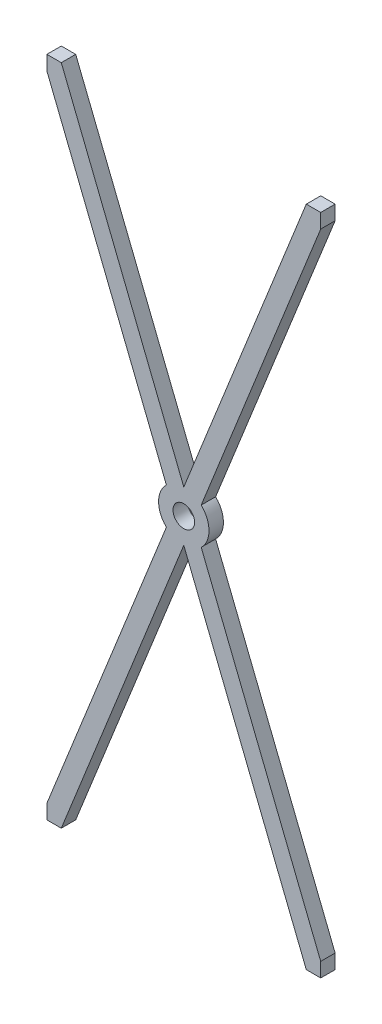
ISO-10303-21;
HEADER;
FILE_DESCRIPTION(('STEP AP214'),'2;1');
FILE_NAME('part.step','',(''),(''),'','','');
FILE_SCHEMA(('AUTOMOTIVE_DESIGN { 1 0 10303 214 1 1 1 1 }'));
ENDSEC;
DATA;
#1=APPLICATION_CONTEXT('core data for automotive mechanical design processes');
#2=APPLICATION_PROTOCOL_DEFINITION('international standard','automotive_design',2000,#1);
#3=PRODUCT_CONTEXT('',#1,'mechanical');
#4=PRODUCT('Part','Part','',(#3));
#5=PRODUCT_RELATED_PRODUCT_CATEGORY('part','',(#4));
#6=PRODUCT_DEFINITION_FORMATION('','',#4);
#7=PRODUCT_DEFINITION_CONTEXT('part definition',#1,'design');
#8=PRODUCT_DEFINITION('design','',#6,#7);
#9=PRODUCT_DEFINITION_SHAPE('','',#8);
#10=(LENGTH_UNIT() NAMED_UNIT(*) SI_UNIT(.MILLI.,.METRE.));
#11=(NAMED_UNIT(*) PLANE_ANGLE_UNIT() SI_UNIT($,.RADIAN.));
#12=(NAMED_UNIT(*) SI_UNIT($,.STERADIAN.) SOLID_ANGLE_UNIT());
#13=UNCERTAINTY_MEASURE_WITH_UNIT(LENGTH_MEASURE(1.E-05),#10,'distance_accuracy_value','');
#14=(GEOMETRIC_REPRESENTATION_CONTEXT(3) GLOBAL_UNCERTAINTY_ASSIGNED_CONTEXT((#13)) GLOBAL_UNIT_ASSIGNED_CONTEXT((#10,
#11,#12)) REPRESENTATION_CONTEXT('',''));
#15=CARTESIAN_POINT('',(0.,0.,0.));
#16=DIRECTION('',(0.,0.,1.));
#17=DIRECTION('',(1.,0.,0.));
#18=AXIS2_PLACEMENT_3D('',#15,#16,#17);
#19=CARTESIAN_POINT('',(0.,0.,50.));
#20=DIRECTION('',(1.,0.,0.));
#21=DIRECTION('',(0.,0.,-1.));
#22=AXIS2_PLACEMENT_3D('',#19,#20,#21);
#23=PLANE('',#22);
#24=DIRECTION('',(0.,-1.,0.));
#25=VECTOR('',#24,1.);
#26=CARTESIAN_POINT('',(0.,0.,0.));
#27=LINE('',#26,#25);
#28=CARTESIAN_POINT('',(0.,50.,0.));
#29=VERTEX_POINT('',#28);
#30=CARTESIAN_POINT('',(0.,0.,0.));
#31=VERTEX_POINT('',#30);
#32=EDGE_CURVE('E292',#29,#31,#27,.T.);
#33=ORIENTED_EDGE('',*,*,#32,.T.);
#34=DIRECTION('',(0.,0.,-1.));
#35=VECTOR('',#34,1.);
#36=CARTESIAN_POINT('',(0.,0.,50.));
#37=LINE('',#36,#35);
#38=CARTESIAN_POINT('',(0.,0.,50.));
#39=VERTEX_POINT('',#38);
#40=EDGE_CURVE('E11',#39,#31,#37,.T.);
#41=ORIENTED_EDGE('',*,*,#40,.F.);
#42=DIRECTION('',(0.,-1.,0.));
#43=VECTOR('',#42,1.);
#44=CARTESIAN_POINT('',(0.,0.,50.));
#45=LINE('',#44,#43);
#46=CARTESIAN_POINT('',(0.,50.,50.));
#47=VERTEX_POINT('',#46);
#48=EDGE_CURVE('E222',#47,#39,#45,.T.);
#49=ORIENTED_EDGE('',*,*,#48,.F.);
#50=DIRECTION('',(0.,0.,-1.));
#51=VECTOR('',#50,1.);
#52=CARTESIAN_POINT('',(0.,50.,50.));
#53=LINE('',#52,#51);
#54=EDGE_CURVE('E223',#47,#29,#53,.T.);
#55=ORIENTED_EDGE('',*,*,#54,.T.);
#56=EDGE_LOOP('',(#33,#41,#49,#55));
#57=FACE_BOUND('',#56,.T.);
#58=ADVANCED_FACE('F39',(#57),#23,.F.);
#59=CARTESIAN_POINT('',(0.,0.,50.));
#60=DIRECTION('',(0.,1.,0.));
#61=DIRECTION('',(0.,0.,1.));
#62=AXIS2_PLACEMENT_3D('',#59,#60,#61);
#63=PLANE('',#62);
#64=DIRECTION('',(1.,0.,0.));
#65=VECTOR('',#64,1.);
#66=CARTESIAN_POINT('',(0.,0.,0.));
#67=LINE('',#66,#65);
#68=CARTESIAN_POINT('',(50.,0.,0.));
#69=VERTEX_POINT('',#68);
#70=EDGE_CURVE('E283',#31,#69,#67,.T.);
#71=ORIENTED_EDGE('',*,*,#70,.T.);
#72=DIRECTION('',(0.,0.,-1.));
#73=VECTOR('',#72,1.);
#74=CARTESIAN_POINT('',(50.,0.,50.));
#75=LINE('',#74,#73);
#76=CARTESIAN_POINT('',(50.,0.,50.));
#77=VERTEX_POINT('',#76);
#78=EDGE_CURVE('E47',#77,#69,#75,.T.);
#79=ORIENTED_EDGE('',*,*,#78,.F.);
#80=DIRECTION('',(1.,0.,0.));
#81=VECTOR('',#80,1.);
#82=CARTESIAN_POINT('',(0.,0.,50.));
#83=LINE('',#82,#81);
#84=EDGE_CURVE('E351',#39,#77,#83,.T.);
#85=ORIENTED_EDGE('',*,*,#84,.F.);
#86=ORIENTED_EDGE('',*,*,#40,.T.);
#87=EDGE_LOOP('',(#71,#79,#85,#86));
#88=FACE_BOUND('',#87,.T.);
#89=ADVANCED_FACE('F374',(#88),#63,.F.);
#90=CARTESIAN_POINT('',(50.,0.,50.));
#91=DIRECTION('',(-0.928476690885259,0.371390676354104,0.));
#92=DIRECTION('',(-0.371390676354104,-0.928476690885259,0.));
#93=AXIS2_PLACEMENT_3D('',#90,#91,#92);
#94=PLANE('',#93);
#95=DIRECTION('',(0.371390676354104,0.928476690885259,0.));
#96=VECTOR('',#95,1.);
#97=CARTESIAN_POINT('',(50.,0.,0.));
#98=LINE('',#97,#96);
#99=CARTESIAN_POINT('',(475.,1062.5,0.));
#100=VERTEX_POINT('',#99);
#101=EDGE_CURVE('E278',#69,#100,#98,.T.);
#102=ORIENTED_EDGE('',*,*,#101,.T.);
#103=DIRECTION('',(0.,0.,-1.));
#104=VECTOR('',#103,1.);
#105=CARTESIAN_POINT('',(475.,1062.5,50.));
#106=LINE('',#105,#104);
#107=CARTESIAN_POINT('',(475.,1062.5,50.));
#108=VERTEX_POINT('',#107);
#109=EDGE_CURVE('E267',#108,#100,#106,.T.);
#110=ORIENTED_EDGE('',*,*,#109,.F.);
#111=DIRECTION('',(0.371390676354104,0.928476690885259,0.));
#112=VECTOR('',#111,1.);
#113=CARTESIAN_POINT('',(50.,0.,50.));
#114=LINE('',#113,#112);
#115=EDGE_CURVE('E279',#77,#108,#114,.T.);
#116=ORIENTED_EDGE('',*,*,#115,.F.);
#117=ORIENTED_EDGE('',*,*,#78,.T.);
#118=EDGE_LOOP('',(#102,#110,#116,#117));
#119=FACE_BOUND('',#118,.T.);
#120=ADVANCED_FACE('F276',(#119),#94,.F.);
#121=CARTESIAN_POINT('',(900.,0.,50.));
#122=DIRECTION('',(0.928476690885259,0.371390676354104,0.));
#123=DIRECTION('',(-0.371390676354104,0.92847669088526,0.));
#124=AXIS2_PLACEMENT_3D('',#121,#122,#123);
#125=PLANE('',#124);
#126=DIRECTION('',(0.371390676354104,-0.928476690885259,0.));
#127=VECTOR('',#126,1.);
#128=CARTESIAN_POINT('',(900.,0.,0.));
#129=LINE('',#128,#127);
#130=CARTESIAN_POINT('',(900.,0.,0.));
#131=VERTEX_POINT('',#130);
#132=EDGE_CURVE('E285',#100,#131,#129,.T.);
#133=ORIENTED_EDGE('',*,*,#132,.T.);
#134=DIRECTION('',(0.,0.,-1.));
#135=VECTOR('',#134,1.);
#136=CARTESIAN_POINT('',(900.,0.,50.));
#137=LINE('',#136,#135);
#138=CARTESIAN_POINT('',(900.,0.,50.));
#139=VERTEX_POINT('',#138);
#140=EDGE_CURVE('E263',#139,#131,#137,.T.);
#141=ORIENTED_EDGE('',*,*,#140,.F.);
#142=DIRECTION('',(0.371390676354104,-0.928476690885259,0.));
#143=VECTOR('',#142,1.);
#144=CARTESIAN_POINT('',(900.,0.,50.));
#145=LINE('',#144,#143);
#146=EDGE_CURVE('E356',#108,#139,#145,.T.);
#147=ORIENTED_EDGE('',*,*,#146,.F.);
#148=ORIENTED_EDGE('',*,*,#109,.T.);
#149=EDGE_LOOP('',(#133,#141,#147,#148));
#150=FACE_BOUND('',#149,.T.);
#151=ADVANCED_FACE('F366',(#150),#125,.F.);
#152=CARTESIAN_POINT('',(900.,0.,50.));
#153=DIRECTION('',(0.,1.,0.));
#154=DIRECTION('',(0.,0.,1.));
#155=AXIS2_PLACEMENT_3D('',#152,#153,#154);
#156=PLANE('',#155);
#157=DIRECTION('',(1.,0.,0.));
#158=VECTOR('',#157,1.);
#159=CARTESIAN_POINT('',(900.,0.,0.));
#160=LINE('',#159,#158);
#161=CARTESIAN_POINT('',(950.,0.,0.));
#162=VERTEX_POINT('',#161);
#163=EDGE_CURVE('E290',#131,#162,#160,.T.);
#164=ORIENTED_EDGE('',*,*,#163,.T.);
#165=DIRECTION('',(0.,0.,-1.));
#166=VECTOR('',#165,1.);
#167=CARTESIAN_POINT('',(950.,0.,50.));
#168=LINE('',#167,#166);
#169=CARTESIAN_POINT('',(950.,0.,50.));
#170=VERTEX_POINT('',#169);
#171=EDGE_CURVE('E259',#170,#162,#168,.T.);
#172=ORIENTED_EDGE('',*,*,#171,.F.);
#173=DIRECTION('',(1.,0.,0.));
#174=VECTOR('',#173,1.);
#175=CARTESIAN_POINT('',(900.,0.,50.));
#176=LINE('',#175,#174);
#177=EDGE_CURVE('E315',#139,#170,#176,.T.);
#178=ORIENTED_EDGE('',*,*,#177,.F.);
#179=ORIENTED_EDGE('',*,*,#140,.T.);
#180=EDGE_LOOP('',(#164,#172,#178,#179));
#181=FACE_BOUND('',#180,.T.);
#182=ADVANCED_FACE('F364',(#181),#156,.F.);
#183=CARTESIAN_POINT('',(950.,50.,50.));
#184=DIRECTION('',(-1.,0.,0.));
#185=DIRECTION('',(0.,0.,1.));
#186=AXIS2_PLACEMENT_3D('',#183,#184,#185);
#187=PLANE('',#186);
#188=DIRECTION('',(0.,1.,0.));
#189=VECTOR('',#188,1.);
#190=CARTESIAN_POINT('',(950.,50.,0.));
#191=LINE('',#190,#189);
#192=CARTESIAN_POINT('',(950.,50.,0.));
#193=VERTEX_POINT('',#192);
#194=EDGE_CURVE('E197',#162,#193,#191,.T.);
#195=ORIENTED_EDGE('',*,*,#194,.T.);
#196=DIRECTION('',(0.,0.,-1.));
#197=VECTOR('',#196,1.);
#198=CARTESIAN_POINT('',(950.,50.,50.));
#199=LINE('',#198,#197);
#200=CARTESIAN_POINT('',(950.,50.,50.));
#201=VERTEX_POINT('',#200);
#202=EDGE_CURVE('E255',#201,#193,#199,.T.);
#203=ORIENTED_EDGE('',*,*,#202,.F.);
#204=DIRECTION('',(0.,1.,0.));
#205=VECTOR('',#204,1.);
#206=CARTESIAN_POINT('',(950.,50.,50.));
#207=LINE('',#206,#205);
#208=EDGE_CURVE('E309',#170,#201,#207,.T.);
#209=ORIENTED_EDGE('',*,*,#208,.F.);
#210=ORIENTED_EDGE('',*,*,#171,.T.);
#211=EDGE_LOOP('',(#195,#203,#209,#210));
#212=FACE_BOUND('',#211,.T.);
#213=ADVANCED_FACE('F301',(#212),#187,.F.);
#214=CARTESIAN_POINT('',(510.,1150.,50.));
#215=DIRECTION('',(-0.928476690885259,-0.371390676354104,0.));
#216=DIRECTION('',(0.371390676354104,-0.92847669088526,0.));
#217=AXIS2_PLACEMENT_3D('',#214,#215,#216);
#218=PLANE('',#217);
#219=DIRECTION('',(-0.371390676354104,0.928476690885259,0.));
#220=VECTOR('',#219,1.);
#221=CARTESIAN_POINT('',(510.,1150.,0.));
#222=LINE('',#221,#220);
#223=CARTESIAN_POINT('',(535.344827586207,1086.63793103448,0.));
#224=VERTEX_POINT('',#223);
#225=EDGE_CURVE('E191',#193,#224,#222,.T.);
#226=ORIENTED_EDGE('',*,*,#225,.T.);
#227=DIRECTION('',(0.,0.,1.));
#228=VECTOR('',#227,1.);
#229=CARTESIAN_POINT('',(535.344827586207,1086.63793103448,0.));
#230=LINE('',#229,#228);
#231=CARTESIAN_POINT('',(535.344827586207,1086.63793103448,50.));
#232=VERTEX_POINT('',#231);
#233=EDGE_CURVE('E168',#224,#232,#230,.T.);
#234=ORIENTED_EDGE('',*,*,#233,.T.);
#235=DIRECTION('',(-0.371390676354104,0.928476690885259,0.));
#236=VECTOR('',#235,1.);
#237=CARTESIAN_POINT('',(510.,1150.,50.));
#238=LINE('',#237,#236);
#239=EDGE_CURVE('E307',#201,#232,#238,.T.);
#240=ORIENTED_EDGE('',*,*,#239,.F.);
#241=ORIENTED_EDGE('',*,*,#202,.T.);
#242=EDGE_LOOP('',(#226,#234,#240,#241));
#243=FACE_BOUND('',#242,.T.);
#244=ADVANCED_FACE('F306',(#243),#218,.F.);
#245=CARTESIAN_POINT('',(510.,1150.,50.));
#246=DIRECTION('',(-0.928476690885259,0.371390676354104,0.));
#247=DIRECTION('',(-0.371390676354104,-0.928476690885259,0.));
#248=AXIS2_PLACEMENT_3D('',#245,#246,#247);
#249=PLANE('',#248);
#250=DIRECTION('',(0.371390676354104,0.928476690885259,0.));
#251=VECTOR('',#250,1.);
#252=CARTESIAN_POINT('',(510.,1150.,50.));
#253=LINE('',#252,#251);
#254=CARTESIAN_POINT('',(535.344827586207,1213.36206896552,50.));
#255=VERTEX_POINT('',#254);
#256=CARTESIAN_POINT('',(950.,2250.,50.));
#257=VERTEX_POINT('',#256);
#258=EDGE_CURVE('E181',#255,#257,#253,.T.);
#259=ORIENTED_EDGE('',*,*,#258,.F.);
#260=DIRECTION('',(0.,0.,1.));
#261=VECTOR('',#260,1.);
#262=CARTESIAN_POINT('',(535.344827586207,1213.36206896552,0.));
#263=LINE('',#262,#261);
#264=CARTESIAN_POINT('',(535.344827586207,1213.36206896552,0.));
#265=VERTEX_POINT('',#264);
#266=EDGE_CURVE('E165',#255,#265,#263,.F.);
#267=ORIENTED_EDGE('',*,*,#266,.T.);
#268=DIRECTION('',(0.371390676354104,0.928476690885259,0.));
#269=VECTOR('',#268,1.);
#270=CARTESIAN_POINT('',(510.,1150.,0.));
#271=LINE('',#270,#269);
#272=CARTESIAN_POINT('',(950.,2250.,0.));
#273=VERTEX_POINT('',#272);
#274=EDGE_CURVE('E179',#265,#273,#271,.T.);
#275=ORIENTED_EDGE('',*,*,#274,.T.);
#276=DIRECTION('',(0.,0.,-1.));
#277=VECTOR('',#276,1.);
#278=CARTESIAN_POINT('',(950.,2250.,50.));
#279=LINE('',#278,#277);
#280=EDGE_CURVE('E252',#257,#273,#279,.T.);
#281=ORIENTED_EDGE('',*,*,#280,.F.);
#282=EDGE_LOOP('',(#259,#267,#275,#281));
#283=FACE_BOUND('',#282,.T.);
#284=ADVANCED_FACE('F177',(#283),#249,.F.);
#285=CARTESIAN_POINT('',(950.,2250.,50.));
#286=DIRECTION('',(-1.,0.,0.));
#287=DIRECTION('',(0.,0.,1.));
#288=AXIS2_PLACEMENT_3D('',#285,#286,#287);
#289=PLANE('',#288);
#290=DIRECTION('',(0.,1.,0.));
#291=VECTOR('',#290,1.);
#292=CARTESIAN_POINT('',(950.,2250.,0.));
#293=LINE('',#292,#291);
#294=CARTESIAN_POINT('',(950.,2300.,0.));
#295=VERTEX_POINT('',#294);
#296=EDGE_CURVE('E189',#273,#295,#293,.T.);
#297=ORIENTED_EDGE('',*,*,#296,.T.);
#298=DIRECTION('',(0.,0.,-1.));
#299=VECTOR('',#298,1.);
#300=CARTESIAN_POINT('',(950.,2300.,50.));
#301=LINE('',#300,#299);
#302=CARTESIAN_POINT('',(950.,2300.,50.));
#303=VERTEX_POINT('',#302);
#304=EDGE_CURVE('E248',#303,#295,#301,.T.);
#305=ORIENTED_EDGE('',*,*,#304,.F.);
#306=DIRECTION('',(0.,1.,0.));
#307=VECTOR('',#306,1.);
#308=CARTESIAN_POINT('',(950.,2250.,50.));
#309=LINE('',#308,#307);
#310=EDGE_CURVE('E313',#257,#303,#309,.T.);
#311=ORIENTED_EDGE('',*,*,#310,.F.);
#312=ORIENTED_EDGE('',*,*,#280,.T.);
#313=EDGE_LOOP('',(#297,#305,#311,#312));
#314=FACE_BOUND('',#313,.T.);
#315=ADVANCED_FACE('F424',(#314),#289,.F.);
#316=CARTESIAN_POINT('',(950.,2300.,50.));
#317=DIRECTION('',(0.,-1.,0.));
#318=DIRECTION('',(0.,0.,-1.));
#319=AXIS2_PLACEMENT_3D('',#316,#317,#318);
#320=PLANE('',#319);
#321=DIRECTION('',(-1.,0.,0.));
#322=VECTOR('',#321,1.);
#323=CARTESIAN_POINT('',(950.,2300.,0.));
#324=LINE('',#323,#322);
#325=CARTESIAN_POINT('',(900.,2300.,0.));
#326=VERTEX_POINT('',#325);
#327=EDGE_CURVE('E195',#295,#326,#324,.T.);
#328=ORIENTED_EDGE('',*,*,#327,.T.);
#329=DIRECTION('',(0.,0.,-1.));
#330=VECTOR('',#329,1.);
#331=CARTESIAN_POINT('',(900.,2300.,50.));
#332=LINE('',#331,#330);
#333=CARTESIAN_POINT('',(900.,2300.,50.));
#334=VERTEX_POINT('',#333);
#335=EDGE_CURVE('E244',#334,#326,#332,.T.);
#336=ORIENTED_EDGE('',*,*,#335,.F.);
#337=DIRECTION('',(-1.,0.,0.));
#338=VECTOR('',#337,1.);
#339=CARTESIAN_POINT('',(950.,2300.,50.));
#340=LINE('',#339,#338);
#341=EDGE_CURVE('E321',#303,#334,#340,.T.);
#342=ORIENTED_EDGE('',*,*,#341,.F.);
#343=ORIENTED_EDGE('',*,*,#304,.T.);
#344=EDGE_LOOP('',(#328,#336,#342,#343));
#345=FACE_BOUND('',#344,.T.);
#346=ADVANCED_FACE('F419',(#345),#320,.F.);
#347=CARTESIAN_POINT('',(900.,2300.,50.));
#348=DIRECTION('',(0.928476690885259,-0.371390676354104,0.));
#349=DIRECTION('',(0.371390676354104,0.92847669088526,0.));
#350=AXIS2_PLACEMENT_3D('',#347,#348,#349);
#351=PLANE('',#350);
#352=DIRECTION('',(-0.371390676354104,-0.928476690885259,0.));
#353=VECTOR('',#352,1.);
#354=CARTESIAN_POINT('',(900.,2300.,0.));
#355=LINE('',#354,#353);
#356=CARTESIAN_POINT('',(475.,1237.5,0.));
#357=VERTEX_POINT('',#356);
#358=EDGE_CURVE('E203',#326,#357,#355,.T.);
#359=ORIENTED_EDGE('',*,*,#358,.T.);
#360=DIRECTION('',(0.,0.,-1.));
#361=VECTOR('',#360,1.);
#362=CARTESIAN_POINT('',(475.,1237.5,50.));
#363=LINE('',#362,#361);
#364=CARTESIAN_POINT('',(475.,1237.5,50.));
#365=VERTEX_POINT('',#364);
#366=EDGE_CURVE('E240',#365,#357,#363,.T.);
#367=ORIENTED_EDGE('',*,*,#366,.F.);
#368=DIRECTION('',(-0.371390676354104,-0.928476690885259,0.));
#369=VECTOR('',#368,1.);
#370=CARTESIAN_POINT('',(900.,2300.,50.));
#371=LINE('',#370,#369);
#372=EDGE_CURVE('E324',#334,#365,#371,.T.);
#373=ORIENTED_EDGE('',*,*,#372,.F.);
#374=ORIENTED_EDGE('',*,*,#335,.T.);
#375=EDGE_LOOP('',(#359,#367,#373,#374));
#376=FACE_BOUND('',#375,.T.);
#377=ADVANCED_FACE('F416',(#376),#351,.F.);
#378=CARTESIAN_POINT('',(50.,2300.,50.));
#379=DIRECTION('',(-0.928476690885259,-0.371390676354104,0.));
#380=DIRECTION('',(0.371390676354104,-0.928476690885259,0.));
#381=AXIS2_PLACEMENT_3D('',#378,#379,#380);
#382=PLANE('',#381);
#383=DIRECTION('',(-0.371390676354104,0.928476690885259,0.));
#384=VECTOR('',#383,1.);
#385=CARTESIAN_POINT('',(50.,2300.,0.));
#386=LINE('',#385,#384);
#387=CARTESIAN_POINT('',(50.,2300.,0.));
#388=VERTEX_POINT('',#387);
#389=EDGE_CURVE('E206',#357,#388,#386,.T.);
#390=ORIENTED_EDGE('',*,*,#389,.T.);
#391=DIRECTION('',(0.,0.,-1.));
#392=VECTOR('',#391,1.);
#393=CARTESIAN_POINT('',(50.,2300.,50.));
#394=LINE('',#393,#392);
#395=CARTESIAN_POINT('',(50.,2300.,50.));
#396=VERTEX_POINT('',#395);
#397=EDGE_CURVE('E236',#396,#388,#394,.T.);
#398=ORIENTED_EDGE('',*,*,#397,.F.);
#399=DIRECTION('',(-0.371390676354104,0.928476690885259,0.));
#400=VECTOR('',#399,1.);
#401=CARTESIAN_POINT('',(50.,2300.,50.));
#402=LINE('',#401,#400);
#403=EDGE_CURVE('E327',#365,#396,#402,.T.);
#404=ORIENTED_EDGE('',*,*,#403,.F.);
#405=ORIENTED_EDGE('',*,*,#366,.T.);
#406=EDGE_LOOP('',(#390,#398,#404,#405));
#407=FACE_BOUND('',#406,.T.);
#408=ADVANCED_FACE('F412',(#407),#382,.F.);
#409=CARTESIAN_POINT('',(0.,2300.,50.));
#410=DIRECTION('',(0.,-1.,0.));
#411=DIRECTION('',(0.,0.,-1.));
#412=AXIS2_PLACEMENT_3D('',#409,#410,#411);
#413=PLANE('',#412);
#414=DIRECTION('',(-1.,0.,0.));
#415=VECTOR('',#414,1.);
#416=CARTESIAN_POINT('',(0.,2300.,0.));
#417=LINE('',#416,#415);
#418=CARTESIAN_POINT('',(0.,2300.,0.));
#419=VERTEX_POINT('',#418);
#420=EDGE_CURVE('E209',#388,#419,#417,.T.);
#421=ORIENTED_EDGE('',*,*,#420,.T.);
#422=DIRECTION('',(0.,0.,-1.));
#423=VECTOR('',#422,1.);
#424=CARTESIAN_POINT('',(0.,2300.,50.));
#425=LINE('',#424,#423);
#426=CARTESIAN_POINT('',(0.,2300.,50.));
#427=VERTEX_POINT('',#426);
#428=EDGE_CURVE('E232',#427,#419,#425,.T.);
#429=ORIENTED_EDGE('',*,*,#428,.F.);
#430=DIRECTION('',(-1.,0.,0.));
#431=VECTOR('',#430,1.);
#432=CARTESIAN_POINT('',(0.,2300.,50.));
#433=LINE('',#432,#431);
#434=EDGE_CURVE('E330',#396,#427,#433,.T.);
#435=ORIENTED_EDGE('',*,*,#434,.F.);
#436=ORIENTED_EDGE('',*,*,#397,.T.);
#437=EDGE_LOOP('',(#421,#429,#435,#436));
#438=FACE_BOUND('',#437,.T.);
#439=ADVANCED_FACE('F407',(#438),#413,.F.);
#440=CARTESIAN_POINT('',(0.,2250.,50.));
#441=DIRECTION('',(1.,0.,0.));
#442=DIRECTION('',(0.,0.,-1.));
#443=AXIS2_PLACEMENT_3D('',#440,#441,#442);
#444=PLANE('',#443);
#445=DIRECTION('',(0.,-1.,0.));
#446=VECTOR('',#445,1.);
#447=CARTESIAN_POINT('',(0.,2250.,0.));
#448=LINE('',#447,#446);
#449=CARTESIAN_POINT('',(0.,2250.,0.));
#450=VERTEX_POINT('',#449);
#451=EDGE_CURVE('E212',#419,#450,#448,.T.);
#452=ORIENTED_EDGE('',*,*,#451,.T.);
#453=DIRECTION('',(0.,0.,-1.));
#454=VECTOR('',#453,1.);
#455=CARTESIAN_POINT('',(0.,2250.,50.));
#456=LINE('',#455,#454);
#457=CARTESIAN_POINT('',(0.,2250.,50.));
#458=VERTEX_POINT('',#457);
#459=EDGE_CURVE('E227',#458,#450,#456,.T.);
#460=ORIENTED_EDGE('',*,*,#459,.F.);
#461=DIRECTION('',(0.,-1.,0.));
#462=VECTOR('',#461,1.);
#463=CARTESIAN_POINT('',(0.,2250.,50.));
#464=LINE('',#463,#462);
#465=EDGE_CURVE('E333',#427,#458,#464,.T.);
#466=ORIENTED_EDGE('',*,*,#465,.F.);
#467=ORIENTED_EDGE('',*,*,#428,.T.);
#468=EDGE_LOOP('',(#452,#460,#466,#467));
#469=FACE_BOUND('',#468,.T.);
#470=ADVANCED_FACE('F401',(#469),#444,.F.);
#471=CARTESIAN_POINT('',(440.,1150.,50.));
#472=DIRECTION('',(0.928476690885259,0.371390676354104,0.));
#473=DIRECTION('',(-0.371390676354104,0.928476690885259,0.));
#474=AXIS2_PLACEMENT_3D('',#471,#472,#473);
#475=PLANE('',#474);
#476=DIRECTION('',(0.371390676354104,-0.928476690885259,0.));
#477=VECTOR('',#476,1.);
#478=CARTESIAN_POINT('',(440.,1150.,0.));
#479=LINE('',#478,#477);
#480=CARTESIAN_POINT('',(414.655172413793,1213.36206896552,0.));
#481=VERTEX_POINT('',#480);
#482=EDGE_CURVE('E215',#450,#481,#479,.T.);
#483=ORIENTED_EDGE('',*,*,#482,.T.);
#484=DIRECTION('',(0.,0.,1.));
#485=VECTOR('',#484,1.);
#486=CARTESIAN_POINT('',(414.655172413793,1213.36206896552,0.));
#487=LINE('',#486,#485);
#488=CARTESIAN_POINT('',(414.655172413793,1213.36206896552,50.));
#489=VERTEX_POINT('',#488);
#490=EDGE_CURVE('E183',#481,#489,#487,.T.);
#491=ORIENTED_EDGE('',*,*,#490,.T.);
#492=DIRECTION('',(0.371390676354104,-0.928476690885259,0.));
#493=VECTOR('',#492,1.);
#494=CARTESIAN_POINT('',(440.,1150.,50.));
#495=LINE('',#494,#493);
#496=EDGE_CURVE('E336',#458,#489,#495,.T.);
#497=ORIENTED_EDGE('',*,*,#496,.F.);
#498=ORIENTED_EDGE('',*,*,#459,.T.);
#499=EDGE_LOOP('',(#483,#491,#497,#498));
#500=FACE_BOUND('',#499,.T.);
#501=ADVANCED_FACE('F396',(#500),#475,.F.);
#502=CARTESIAN_POINT('',(440.,1150.,50.));
#503=DIRECTION('',(0.928476690885259,-0.371390676354104,0.));
#504=DIRECTION('',(0.371390676354104,0.92847669088526,0.));
#505=AXIS2_PLACEMENT_3D('',#502,#503,#504);
#506=PLANE('',#505);
#507=DIRECTION('',(-0.371390676354104,-0.928476690885259,0.));
#508=VECTOR('',#507,1.);
#509=CARTESIAN_POINT('',(440.,1150.,50.));
#510=LINE('',#509,#508);
#511=CARTESIAN_POINT('',(414.655172413793,1086.63793103448,50.));
#512=VERTEX_POINT('',#511);
#513=EDGE_CURVE('E228',#512,#47,#510,.T.);
#514=ORIENTED_EDGE('',*,*,#513,.F.);
#515=DIRECTION('',(0.,0.,1.));
#516=VECTOR('',#515,1.);
#517=CARTESIAN_POINT('',(414.655172413793,1086.63793103448,0.));
#518=LINE('',#517,#516);
#519=CARTESIAN_POINT('',(414.655172413793,1086.63793103448,0.));
#520=VERTEX_POINT('',#519);
#521=EDGE_CURVE('E388',#512,#520,#518,.F.);
#522=ORIENTED_EDGE('',*,*,#521,.T.);
#523=DIRECTION('',(-0.371390676354104,-0.928476690885259,0.));
#524=VECTOR('',#523,1.);
#525=CARTESIAN_POINT('',(440.,1150.,0.));
#526=LINE('',#525,#524);
#527=EDGE_CURVE('E219',#520,#29,#526,.T.);
#528=ORIENTED_EDGE('',*,*,#527,.T.);
#529=ORIENTED_EDGE('',*,*,#54,.F.);
#530=EDGE_LOOP('',(#514,#522,#528,#529));
#531=FACE_BOUND('',#530,.T.);
#532=ADVANCED_FACE('F387',(#531),#506,.F.);
#533=CARTESIAN_POINT('',(0.,0.,50.));
#534=DIRECTION('',(0.,0.,-1.));
#535=DIRECTION('',(-1.,0.,0.));
#536=AXIS2_PLACEMENT_3D('',#533,#534,#535);
#537=PLANE('',#536);
#538=CARTESIAN_POINT('',(475.,1150.,50.));
#539=DIRECTION('',(0.,0.,1.));
#540=DIRECTION('',(1.,0.,0.));
#541=AXIS2_PLACEMENT_3D('',#538,#539,#540);
#542=CIRCLE('',#541,37.5);
#543=CARTESIAN_POINT('',(512.5,1150.,50.));
#544=VERTEX_POINT('',#543);
#545=EDGE_CURVE('E569',#544,#544,#542,.T.);
#546=ORIENTED_EDGE('',*,*,#545,.F.);
#547=EDGE_LOOP('',(#546));
#548=FACE_BOUND('',#547,.T.);
#549=ORIENTED_EDGE('',*,*,#115,.T.);
#550=ORIENTED_EDGE('',*,*,#146,.T.);
#551=ORIENTED_EDGE('',*,*,#177,.T.);
#552=ORIENTED_EDGE('',*,*,#208,.T.);
#553=ORIENTED_EDGE('',*,*,#239,.T.);
#554=CARTESIAN_POINT('',(475.,1150.,50.));
#555=DIRECTION('',(0.,0.,1.));
#556=DIRECTION('',(1.,0.,0.));
#557=AXIS2_PLACEMENT_3D('',#554,#555,#556);
#558=CIRCLE('',#557,87.4999999999994);
#559=EDGE_CURVE('E61',#232,#255,#558,.T.);
#560=ORIENTED_EDGE('',*,*,#559,.T.);
#561=ORIENTED_EDGE('',*,*,#258,.T.);
#562=ORIENTED_EDGE('',*,*,#310,.T.);
#563=ORIENTED_EDGE('',*,*,#341,.T.);
#564=ORIENTED_EDGE('',*,*,#372,.T.);
#565=ORIENTED_EDGE('',*,*,#403,.T.);
#566=ORIENTED_EDGE('',*,*,#434,.T.);
#567=ORIENTED_EDGE('',*,*,#465,.T.);
#568=ORIENTED_EDGE('',*,*,#496,.T.);
#569=EDGE_CURVE('E54',#489,#512,#558,.T.);
#570=ORIENTED_EDGE('',*,*,#569,.T.);
#571=ORIENTED_EDGE('',*,*,#513,.T.);
#572=ORIENTED_EDGE('',*,*,#48,.T.);
#573=ORIENTED_EDGE('',*,*,#84,.T.);
#574=EDGE_LOOP('',(#549,#550,#551,#552,#553,#560,#561,#562,#563,#564,#565,#566,#567,#568,#570,
#571,#572,#573));
#575=FACE_BOUND('',#574,.T.);
#576=ADVANCED_FACE('F360',(#548,#575),#537,.F.);
#577=CARTESIAN_POINT('',(0.,0.,0.));
#578=DIRECTION('',(0.,0.,-1.));
#579=DIRECTION('',(-1.,0.,0.));
#580=AXIS2_PLACEMENT_3D('',#577,#578,#579);
#581=PLANE('',#580);
#582=CARTESIAN_POINT('',(475.,1150.,0.));
#583=DIRECTION('',(0.,0.,1.));
#584=DIRECTION('',(1.,0.,0.));
#585=AXIS2_PLACEMENT_3D('',#582,#583,#584);
#586=CIRCLE('',#585,37.5);
#587=CARTESIAN_POINT('',(512.5,1150.,0.));
#588=VERTEX_POINT('',#587);
#589=EDGE_CURVE('E566',#588,#588,#586,.T.);
#590=ORIENTED_EDGE('',*,*,#589,.T.);
#591=EDGE_LOOP('',(#590));
#592=FACE_BOUND('',#591,.T.);
#593=ORIENTED_EDGE('',*,*,#527,.F.);
#594=CARTESIAN_POINT('',(475.,1150.,0.));
#595=DIRECTION('',(0.,0.,1.));
#596=DIRECTION('',(1.,0.,0.));
#597=AXIS2_PLACEMENT_3D('',#594,#595,#596);
#598=CIRCLE('',#597,87.4999999999994);
#599=EDGE_CURVE('E174',#481,#520,#598,.T.);
#600=ORIENTED_EDGE('',*,*,#599,.F.);
#601=ORIENTED_EDGE('',*,*,#482,.F.);
#602=ORIENTED_EDGE('',*,*,#451,.F.);
#603=ORIENTED_EDGE('',*,*,#420,.F.);
#604=ORIENTED_EDGE('',*,*,#389,.F.);
#605=ORIENTED_EDGE('',*,*,#358,.F.);
#606=ORIENTED_EDGE('',*,*,#327,.F.);
#607=ORIENTED_EDGE('',*,*,#296,.F.);
#608=ORIENTED_EDGE('',*,*,#274,.F.);
#609=EDGE_CURVE('E162',#224,#265,#598,.T.);
#610=ORIENTED_EDGE('',*,*,#609,.F.);
#611=ORIENTED_EDGE('',*,*,#225,.F.);
#612=ORIENTED_EDGE('',*,*,#194,.F.);
#613=ORIENTED_EDGE('',*,*,#163,.F.);
#614=ORIENTED_EDGE('',*,*,#132,.F.);
#615=ORIENTED_EDGE('',*,*,#101,.F.);
#616=ORIENTED_EDGE('',*,*,#70,.F.);
#617=ORIENTED_EDGE('',*,*,#32,.F.);
#618=EDGE_LOOP('',(#593,#600,#601,#602,#603,#604,#605,#606,#607,#608,#610,#611,#612,#613,#614,
#615,#616,#617));
#619=FACE_BOUND('',#618,.T.);
#620=ADVANCED_FACE('F187',(#592,#619),#581,.T.);
#621=CARTESIAN_POINT('',(475.,1150.,0.));
#622=DIRECTION('',(0.,0.,1.));
#623=DIRECTION('',(1.,0.,0.));
#624=AXIS2_PLACEMENT_3D('',#621,#622,#623);
#625=CYLINDRICAL_SURFACE('',#624,87.4999999999994);
#626=ORIENTED_EDGE('',*,*,#490,.F.);
#627=ORIENTED_EDGE('',*,*,#599,.T.);
#628=ORIENTED_EDGE('',*,*,#521,.F.);
#629=ORIENTED_EDGE('',*,*,#569,.F.);
#630=EDGE_LOOP('',(#626,#627,#628,#629));
#631=FACE_BOUND('',#630,.T.);
#632=ADVANCED_FACE('F473',(#631),#625,.T.);
#633=ORIENTED_EDGE('',*,*,#233,.F.);
#634=ORIENTED_EDGE('',*,*,#609,.T.);
#635=ORIENTED_EDGE('',*,*,#266,.F.);
#636=ORIENTED_EDGE('',*,*,#559,.F.);
#637=EDGE_LOOP('',(#633,#634,#635,#636));
#638=FACE_BOUND('',#637,.T.);
#639=ADVANCED_FACE('F164',(#638),#625,.T.);
#640=CARTESIAN_POINT('',(475.,1150.,0.));
#641=DIRECTION('',(0.,0.,1.));
#642=DIRECTION('',(1.,0.,0.));
#643=AXIS2_PLACEMENT_3D('',#640,#641,#642);
#644=CYLINDRICAL_SURFACE('',#643,37.5);
#645=ORIENTED_EDGE('',*,*,#589,.F.);
#646=EDGE_LOOP('',(#645));
#647=FACE_BOUND('',#646,.T.);
#648=ORIENTED_EDGE('',*,*,#545,.T.);
#649=EDGE_LOOP('',(#648));
#650=FACE_BOUND('',#649,.T.);
#651=ADVANCED_FACE('F488',(#647,#650),#644,.F.);
#652=CLOSED_SHELL('',(#58,#89,#120,#151,#182,#213,#244,#284,#315,#346,#377,#408,#439,#470,#501,
#532,#576,#620,#632,#639,#651));
#653=MANIFOLD_SOLID_BREP('B2',#652);
#654=ADVANCED_BREP_SHAPE_REPRESENTATION('',(#18,#653),#14);
#655=SHAPE_DEFINITION_REPRESENTATION(#9,#654);
ENDSEC;
END-ISO-10303-21;
